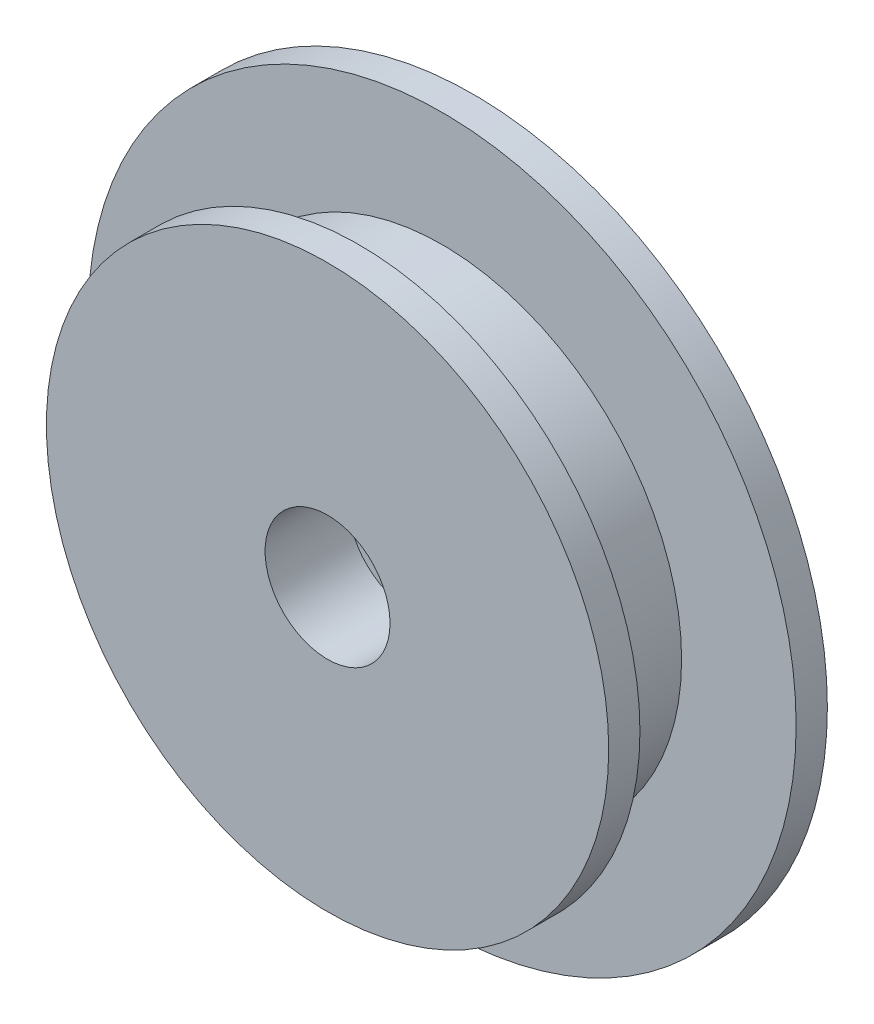
ISO-10303-21;
HEADER;
FILE_DESCRIPTION(('STEP AP214'),'2;1');
FILE_NAME('part.step','',(''),(''),'','','');
FILE_SCHEMA(('AUTOMOTIVE_DESIGN { 1 0 10303 214 1 1 1 1 }'));
ENDSEC;
DATA;
#1=APPLICATION_CONTEXT('core data for automotive mechanical design processes');
#2=APPLICATION_PROTOCOL_DEFINITION('international standard','automotive_design',2000,#1);
#3=PRODUCT_CONTEXT('',#1,'mechanical');
#4=PRODUCT('Part','Part','',(#3));
#5=PRODUCT_RELATED_PRODUCT_CATEGORY('part','',(#4));
#6=PRODUCT_DEFINITION_FORMATION('','',#4);
#7=PRODUCT_DEFINITION_CONTEXT('part definition',#1,'design');
#8=PRODUCT_DEFINITION('design','',#6,#7);
#9=PRODUCT_DEFINITION_SHAPE('','',#8);
#10=(LENGTH_UNIT() NAMED_UNIT(*) SI_UNIT(.MILLI.,.METRE.));
#11=(NAMED_UNIT(*) PLANE_ANGLE_UNIT() SI_UNIT($,.RADIAN.));
#12=(NAMED_UNIT(*) SI_UNIT($,.STERADIAN.) SOLID_ANGLE_UNIT());
#13=UNCERTAINTY_MEASURE_WITH_UNIT(LENGTH_MEASURE(1.E-05),#10,'distance_accuracy_value','');
#14=(GEOMETRIC_REPRESENTATION_CONTEXT(3) GLOBAL_UNCERTAINTY_ASSIGNED_CONTEXT((#13)) GLOBAL_UNIT_ASSIGNED_CONTEXT((#10,
#11,#12)) REPRESENTATION_CONTEXT('',''));
#15=CARTESIAN_POINT('',(0.,0.,0.));
#16=DIRECTION('',(0.,0.,1.));
#17=DIRECTION('',(1.,0.,0.));
#18=AXIS2_PLACEMENT_3D('',#15,#16,#17);
#19=CARTESIAN_POINT('',(0.,0.,0.));
#20=DIRECTION('',(0.,0.,1.));
#21=DIRECTION('',(1.,0.,0.));
#22=AXIS2_PLACEMENT_3D('',#19,#20,#21);
#23=CYLINDRICAL_SURFACE('',#22,1.75);
#24=CARTESIAN_POINT('',(0.,0.,0.));
#25=DIRECTION('',(0.,0.,1.));
#26=DIRECTION('',(1.,0.,0.));
#27=AXIS2_PLACEMENT_3D('',#24,#25,#26);
#28=CIRCLE('',#27,1.75);
#29=CARTESIAN_POINT('',(1.75,0.,0.));
#30=VERTEX_POINT('',#29);
#31=EDGE_CURVE('E80',#30,#30,#28,.T.);
#32=CARTESIAN_POINT('',(0.,0.,3.));
#33=DIRECTION('',(0.,0.,1.));
#34=DIRECTION('',(1.,0.,0.));
#35=AXIS2_PLACEMENT_3D('',#32,#33,#34);
#36=CIRCLE('',#35,1.75);
#37=CARTESIAN_POINT('',(1.75,0.,3.));
#38=VERTEX_POINT('',#37);
#39=EDGE_CURVE('E47',#38,#38,#36,.F.);
#40=CARTESIAN_POINT('',(1.75,0.,0.));
#41=CARTESIAN_POINT('',(1.75,0.,0.03125));
#42=CARTESIAN_POINT('',(1.75,0.,0.0625));
#43=CARTESIAN_POINT('',(1.75,0.,0.125));
#44=CARTESIAN_POINT('',(1.75,0.,0.15625));
#45=CARTESIAN_POINT('',(1.75,0.,0.21875));
#46=CARTESIAN_POINT('',(1.75,0.,0.25));
#47=CARTESIAN_POINT('',(1.75,0.,0.3125));
#48=CARTESIAN_POINT('',(1.75,0.,0.34375));
#49=CARTESIAN_POINT('',(1.75,0.,0.40625));
#50=CARTESIAN_POINT('',(1.75,0.,0.4375));
#51=CARTESIAN_POINT('',(1.75,0.,0.5));
#52=CARTESIAN_POINT('',(1.75,0.,0.53125));
#53=CARTESIAN_POINT('',(1.75,0.,0.59375));
#54=CARTESIAN_POINT('',(1.75,0.,0.625));
#55=CARTESIAN_POINT('',(1.75,0.,0.6875));
#56=CARTESIAN_POINT('',(1.75,0.,0.71875));
#57=CARTESIAN_POINT('',(1.75,0.,0.78125));
#58=CARTESIAN_POINT('',(1.75,0.,0.8125));
#59=CARTESIAN_POINT('',(1.75,0.,0.875));
#60=CARTESIAN_POINT('',(1.75,0.,0.90625));
#61=CARTESIAN_POINT('',(1.75,0.,0.96875));
#62=CARTESIAN_POINT('',(1.75,0.,0.999999999999999));
#63=CARTESIAN_POINT('',(1.75,0.,1.0625));
#64=CARTESIAN_POINT('',(1.75,0.,1.09375));
#65=CARTESIAN_POINT('',(1.75,0.,1.15625));
#66=CARTESIAN_POINT('',(1.75,0.,1.1875));
#67=CARTESIAN_POINT('',(1.75,0.,1.25));
#68=CARTESIAN_POINT('',(1.75,0.,1.28125));
#69=CARTESIAN_POINT('',(1.75,0.,1.34375));
#70=CARTESIAN_POINT('',(1.75,0.,1.375));
#71=CARTESIAN_POINT('',(1.75,0.,1.4375));
#72=CARTESIAN_POINT('',(1.75,0.,1.46875));
#73=CARTESIAN_POINT('',(1.75,0.,1.53125));
#74=CARTESIAN_POINT('',(1.75,0.,1.5625));
#75=CARTESIAN_POINT('',(1.75,0.,1.625));
#76=CARTESIAN_POINT('',(1.75,0.,1.65625));
#77=CARTESIAN_POINT('',(1.75,0.,1.71875));
#78=CARTESIAN_POINT('',(1.75,0.,1.75));
#79=CARTESIAN_POINT('',(1.75,0.,1.8125));
#80=CARTESIAN_POINT('',(1.75,0.,1.84375));
#81=CARTESIAN_POINT('',(1.75,0.,1.90625));
#82=CARTESIAN_POINT('',(1.75,0.,1.9375));
#83=CARTESIAN_POINT('',(1.75,0.,2.));
#84=CARTESIAN_POINT('',(1.75,0.,2.03125));
#85=CARTESIAN_POINT('',(1.75,0.,2.09375));
#86=CARTESIAN_POINT('',(1.75,0.,2.125));
#87=CARTESIAN_POINT('',(1.75,0.,2.1875));
#88=CARTESIAN_POINT('',(1.75,0.,2.21875));
#89=CARTESIAN_POINT('',(1.75,0.,2.28125));
#90=CARTESIAN_POINT('',(1.75,0.,2.3125));
#91=CARTESIAN_POINT('',(1.75,0.,2.375));
#92=CARTESIAN_POINT('',(1.75,0.,2.40625));
#93=CARTESIAN_POINT('',(1.75,0.,2.46875));
#94=CARTESIAN_POINT('',(1.75,0.,2.5));
#95=CARTESIAN_POINT('',(1.75,0.,2.5625));
#96=CARTESIAN_POINT('',(1.75,0.,2.59375));
#97=CARTESIAN_POINT('',(1.75,0.,2.65625));
#98=CARTESIAN_POINT('',(1.75,0.,2.6875));
#99=CARTESIAN_POINT('',(1.75,0.,2.75));
#100=CARTESIAN_POINT('',(1.75,0.,2.78125));
#101=CARTESIAN_POINT('',(1.75,0.,2.84375));
#102=CARTESIAN_POINT('',(1.75,0.,2.875));
#103=CARTESIAN_POINT('',(1.75,0.,2.9375));
#104=CARTESIAN_POINT('',(1.75,0.,2.96875));
#105=CARTESIAN_POINT('',(1.75,0.,3.));
#106=B_SPLINE_CURVE_WITH_KNOTS('',3,(#40,#41,#42,#43,#44,#45,#46,#47,#48,#49,#50,#51,#52,#53,
#54,#55,#56,#57,#58,#59,#60,#61,#62,#63,#64,#65,#66,#67,#68,#69,#70,#71,#72,#73,#74,#75,#76,#77,
#78,#79,#80,#81,#82,#83,#84,#85,#86,#87,#88,#89,#90,#91,#92,#93,#94,#95,#96,#97,#98,#99,#100,
#101,#102,#103,#104,#105),.UNSPECIFIED.,.F.,.F.,(4,2,2,2,2,2,2,2,2,2,2,2,2,2,2,2,2,2,2,2,2,2,2,
2,2,2,2,2,2,2,2,2,4),(0.,0.09375,0.1875,0.28125,0.375,0.46875,0.5625,0.65625,0.75,0.84375,
0.9375,1.03125,1.125,1.21875,1.3125,1.40625,1.5,1.59375,1.6875,1.78125,1.875,1.96875,2.0625,
2.15625,2.25,2.34375,2.4375,2.53125,2.625,2.71875,2.8125,2.90625,3.),.UNSPECIFIED.);
#107=EDGE_CURVE('BSEAM43',#30,#38,#106,.T.);
#108=ORIENTED_EDGE('',*,*,#31,.F.);
#109=ORIENTED_EDGE('',*,*,#39,.F.);
#110=ORIENTED_EDGE('',*,*,#107,.T.);
#111=ORIENTED_EDGE('',*,*,#107,.F.);
#112=EDGE_LOOP('',(#108,#110,#109,#111));
#113=FACE_BOUND('',#112,.T.);
#114=ADVANCED_FACE('F43',(#113),#23,.F.);
#115=CARTESIAN_POINT('',(0.,0.,1.5));
#116=DIRECTION('',(0.,0.,-1.));
#117=DIRECTION('',(-1.,0.,0.));
#118=AXIS2_PLACEMENT_3D('',#115,#116,#117);
#119=CYLINDRICAL_SURFACE('',#118,17.);
#120=CARTESIAN_POINT('',(0.,0.,1.5));
#121=DIRECTION('',(0.,0.,1.));
#122=DIRECTION('',(1.,0.,0.));
#123=AXIS2_PLACEMENT_3D('',#120,#121,#122);
#124=CIRCLE('',#123,17.);
#125=CARTESIAN_POINT('',(17.,0.,1.5));
#126=VERTEX_POINT('',#125);
#127=EDGE_CURVE('E52',#126,#126,#124,.T.);
#128=ORIENTED_EDGE('',*,*,#127,.F.);
#129=EDGE_LOOP('',(#128));
#130=FACE_BOUND('',#129,.T.);
#131=CARTESIAN_POINT('',(0.,0.,0.));
#132=DIRECTION('',(0.,0.,1.));
#133=DIRECTION('',(1.,0.,0.));
#134=AXIS2_PLACEMENT_3D('',#131,#132,#133);
#135=CIRCLE('',#134,17.);
#136=CARTESIAN_POINT('',(17.,0.,0.));
#137=VERTEX_POINT('',#136);
#138=EDGE_CURVE('E58',#137,#137,#135,.T.);
#139=ORIENTED_EDGE('',*,*,#138,.T.);
#140=EDGE_LOOP('',(#139));
#141=FACE_BOUND('',#140,.T.);
#142=ADVANCED_FACE('F45',(#130,#141),#119,.T.);
#143=CARTESIAN_POINT('',(0.,0.,1.5));
#144=DIRECTION('',(0.,0.,1.));
#145=DIRECTION('',(1.,0.,0.));
#146=AXIS2_PLACEMENT_3D('',#143,#144,#145);
#147=PLANE('',#146);
#148=CARTESIAN_POINT('',(0.,0.,1.5));
#149=DIRECTION('',(0.,0.,1.));
#150=DIRECTION('',(1.,0.,0.));
#151=AXIS2_PLACEMENT_3D('',#148,#149,#150);
#152=CIRCLE('',#151,11.5);
#153=CARTESIAN_POINT('',(11.5,0.,1.5));
#154=VERTEX_POINT('',#153);
#155=EDGE_CURVE('E10',#154,#154,#152,.T.);
#156=ORIENTED_EDGE('',*,*,#155,.F.);
#157=EDGE_LOOP('',(#156));
#158=FACE_BOUND('',#157,.T.);
#159=ORIENTED_EDGE('',*,*,#127,.T.);
#160=EDGE_LOOP('',(#159));
#161=FACE_BOUND('',#160,.T.);
#162=ADVANCED_FACE('F108',(#158,#161),#147,.T.);
#163=CARTESIAN_POINT('',(0.,0.,0.));
#164=DIRECTION('',(0.,0.,1.));
#165=DIRECTION('',(1.,0.,0.));
#166=AXIS2_PLACEMENT_3D('',#163,#164,#165);
#167=PLANE('',#166);
#168=ORIENTED_EDGE('',*,*,#31,.T.);
#169=EDGE_LOOP('',(#168));
#170=FACE_BOUND('',#169,.T.);
#171=ORIENTED_EDGE('',*,*,#138,.F.);
#172=EDGE_LOOP('',(#171));
#173=FACE_BOUND('',#172,.T.);
#174=ADVANCED_FACE('F128',(#170,#173),#167,.F.);
#175=CARTESIAN_POINT('',(0.,0.,5.5));
#176=DIRECTION('',(0.,0.,-1.));
#177=DIRECTION('',(-1.,0.,0.));
#178=AXIS2_PLACEMENT_3D('',#175,#176,#177);
#179=CYLINDRICAL_SURFACE('',#178,11.5);
#180=CARTESIAN_POINT('',(0.,0.,5.5));
#181=DIRECTION('',(0.,0.,1.));
#182=DIRECTION('',(1.,0.,0.));
#183=AXIS2_PLACEMENT_3D('',#180,#181,#182);
#184=CIRCLE('',#183,11.5);
#185=CARTESIAN_POINT('',(11.5,0.,5.5));
#186=VERTEX_POINT('',#185);
#187=EDGE_CURVE('E61',#186,#186,#184,.T.);
#188=ORIENTED_EDGE('',*,*,#187,.F.);
#189=EDGE_LOOP('',(#188));
#190=FACE_BOUND('',#189,.T.);
#191=ORIENTED_EDGE('',*,*,#155,.T.);
#192=EDGE_LOOP('',(#191));
#193=FACE_BOUND('',#192,.T.);
#194=ADVANCED_FACE('F124',(#190,#193),#179,.T.);
#195=CARTESIAN_POINT('',(0.,0.,7.));
#196=DIRECTION('',(0.,0.,-1.));
#197=DIRECTION('',(-1.,0.,0.));
#198=AXIS2_PLACEMENT_3D('',#195,#196,#197);
#199=CYLINDRICAL_SURFACE('',#198,13.5);
#200=CARTESIAN_POINT('',(0.,0.,7.));
#201=DIRECTION('',(0.,0.,1.));
#202=DIRECTION('',(1.,0.,0.));
#203=AXIS2_PLACEMENT_3D('',#200,#201,#202);
#204=CIRCLE('',#203,13.5);
#205=CARTESIAN_POINT('',(13.5,0.,7.));
#206=VERTEX_POINT('',#205);
#207=EDGE_CURVE('E69',#206,#206,#204,.T.);
#208=ORIENTED_EDGE('',*,*,#207,.F.);
#209=EDGE_LOOP('',(#208));
#210=FACE_BOUND('',#209,.T.);
#211=CARTESIAN_POINT('',(0.,0.,5.5));
#212=DIRECTION('',(0.,0.,1.));
#213=DIRECTION('',(1.,0.,0.));
#214=AXIS2_PLACEMENT_3D('',#211,#212,#213);
#215=CIRCLE('',#214,13.5);
#216=CARTESIAN_POINT('',(13.5,0.,5.5));
#217=VERTEX_POINT('',#216);
#218=EDGE_CURVE('E74',#217,#217,#215,.T.);
#219=ORIENTED_EDGE('',*,*,#218,.T.);
#220=EDGE_LOOP('',(#219));
#221=FACE_BOUND('',#220,.T.);
#222=ADVANCED_FACE('F118',(#210,#221),#199,.T.);
#223=CARTESIAN_POINT('',(0.,0.,7.));
#224=DIRECTION('',(0.,0.,1.));
#225=DIRECTION('',(1.,0.,0.));
#226=AXIS2_PLACEMENT_3D('',#223,#224,#225);
#227=PLANE('',#226);
#228=CARTESIAN_POINT('',(0.,0.,7.));
#229=DIRECTION('',(0.,0.,1.));
#230=DIRECTION('',(1.,0.,0.));
#231=AXIS2_PLACEMENT_3D('',#228,#229,#230);
#232=CIRCLE('',#231,3.);
#233=CARTESIAN_POINT('',(3.,0.,7.));
#234=VERTEX_POINT('',#233);
#235=EDGE_CURVE('E85',#234,#234,#232,.T.);
#236=ORIENTED_EDGE('',*,*,#235,.F.);
#237=EDGE_LOOP('',(#236));
#238=FACE_BOUND('',#237,.T.);
#239=ORIENTED_EDGE('',*,*,#207,.T.);
#240=EDGE_LOOP('',(#239));
#241=FACE_BOUND('',#240,.T.);
#242=ADVANCED_FACE('F115',(#238,#241),#227,.T.);
#243=CARTESIAN_POINT('',(0.,0.,5.5));
#244=DIRECTION('',(0.,0.,1.));
#245=DIRECTION('',(1.,0.,0.));
#246=AXIS2_PLACEMENT_3D('',#243,#244,#245);
#247=PLANE('',#246);
#248=ORIENTED_EDGE('',*,*,#187,.T.);
#249=EDGE_LOOP('',(#248));
#250=FACE_BOUND('',#249,.T.);
#251=ORIENTED_EDGE('',*,*,#218,.F.);
#252=EDGE_LOOP('',(#251));
#253=FACE_BOUND('',#252,.T.);
#254=ADVANCED_FACE('F117',(#250,#253),#247,.F.);
#255=CARTESIAN_POINT('',(0.,0.,3.));
#256=DIRECTION('',(0.,0.,1.));
#257=DIRECTION('',(1.,0.,0.));
#258=AXIS2_PLACEMENT_3D('',#255,#256,#257);
#259=PLANE('',#258);
#260=CARTESIAN_POINT('',(0.,0.,3.));
#261=DIRECTION('',(0.,0.,1.));
#262=DIRECTION('',(1.,0.,0.));
#263=AXIS2_PLACEMENT_3D('',#260,#261,#262);
#264=CIRCLE('',#263,3.);
#265=CARTESIAN_POINT('',(3.,0.,3.));
#266=VERTEX_POINT('',#265);
#267=EDGE_CURVE('E89',#266,#266,#264,.T.);
#268=ORIENTED_EDGE('',*,*,#267,.T.);
#269=EDGE_LOOP('',(#268));
#270=FACE_BOUND('',#269,.T.);
#271=ORIENTED_EDGE('',*,*,#39,.T.);
#272=EDGE_LOOP('',(#271));
#273=FACE_BOUND('',#272,.T.);
#274=ADVANCED_FACE('F98',(#270,#273),#259,.T.);
#275=CARTESIAN_POINT('',(0.,0.,3.));
#276=DIRECTION('',(0.,0.,1.));
#277=DIRECTION('',(1.,0.,0.));
#278=AXIS2_PLACEMENT_3D('',#275,#276,#277);
#279=CYLINDRICAL_SURFACE('',#278,3.);
#280=ORIENTED_EDGE('',*,*,#267,.F.);
#281=EDGE_LOOP('',(#280));
#282=FACE_BOUND('',#281,.T.);
#283=ORIENTED_EDGE('',*,*,#235,.T.);
#284=EDGE_LOOP('',(#283));
#285=FACE_BOUND('',#284,.T.);
#286=ADVANCED_FACE('F113',(#282,#285),#279,.F.);
#287=CLOSED_SHELL('',(#114,#142,#162,#174,#194,#222,#242,#254,#274,#286));
#288=MANIFOLD_SOLID_BREP('B2',#287);
#289=ADVANCED_BREP_SHAPE_REPRESENTATION('',(#18,#288),#14);
#290=SHAPE_DEFINITION_REPRESENTATION(#9,#289);
ENDSEC;
END-ISO-10303-21;
